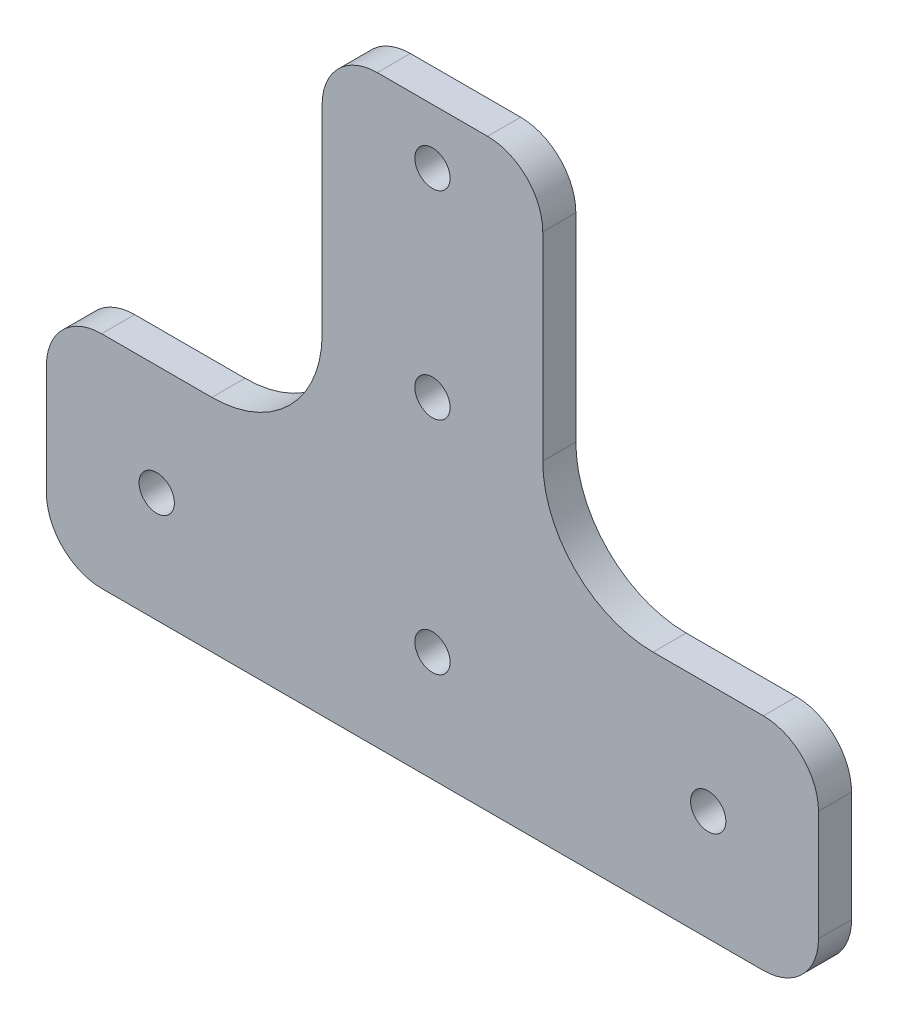
ISO-10303-21;
HEADER;
FILE_DESCRIPTION(('STEP AP214'),'2;1');
FILE_NAME('part.step','',(''),(''),'','','');
FILE_SCHEMA(('AUTOMOTIVE_DESIGN { 1 0 10303 214 1 1 1 1 }'));
ENDSEC;
DATA;
#1=APPLICATION_CONTEXT('core data for automotive mechanical design processes');
#2=APPLICATION_PROTOCOL_DEFINITION('international standard','automotive_design',2000,#1);
#3=PRODUCT_CONTEXT('',#1,'mechanical');
#4=PRODUCT('Part','Part','',(#3));
#5=PRODUCT_RELATED_PRODUCT_CATEGORY('part','',(#4));
#6=PRODUCT_DEFINITION_FORMATION('','',#4);
#7=PRODUCT_DEFINITION_CONTEXT('part definition',#1,'design');
#8=PRODUCT_DEFINITION('design','',#6,#7);
#9=PRODUCT_DEFINITION_SHAPE('','',#8);
#10=(LENGTH_UNIT() NAMED_UNIT(*) SI_UNIT(.MILLI.,.METRE.));
#11=(NAMED_UNIT(*) PLANE_ANGLE_UNIT() SI_UNIT($,.RADIAN.));
#12=(NAMED_UNIT(*) SI_UNIT($,.STERADIAN.) SOLID_ANGLE_UNIT());
#13=UNCERTAINTY_MEASURE_WITH_UNIT(LENGTH_MEASURE(1.E-05),#10,'distance_accuracy_value','');
#14=(GEOMETRIC_REPRESENTATION_CONTEXT(3) GLOBAL_UNCERTAINTY_ASSIGNED_CONTEXT((#13)) GLOBAL_UNIT_ASSIGNED_CONTEXT((#10,
#11,#12)) REPRESENTATION_CONTEXT('',''));
#15=CARTESIAN_POINT('',(0.,0.,0.));
#16=DIRECTION('',(0.,0.,1.));
#17=DIRECTION('',(1.,0.,0.));
#18=AXIS2_PLACEMENT_3D('',#15,#16,#17);
#19=CARTESIAN_POINT('',(0.,0.,3.));
#20=DIRECTION('',(1.,0.,0.));
#21=DIRECTION('',(0.,1.,0.));
#22=AXIS2_PLACEMENT_3D('',#19,#20,#21);
#23=PLANE('',#22);
#24=DIRECTION('',(0.,-1.,0.));
#25=VECTOR('',#24,1.);
#26=CARTESIAN_POINT('',(0.,0.,3.));
#27=LINE('',#26,#25);
#28=CARTESIAN_POINT('',(0.,48.,3.));
#29=VERTEX_POINT('',#28);
#30=CARTESIAN_POINT('',(0.,30.,3.));
#31=VERTEX_POINT('',#30);
#32=EDGE_CURVE('E265',#29,#31,#27,.T.);
#33=ORIENTED_EDGE('',*,*,#32,.F.);
#34=DIRECTION('',(0.,0.,-1.));
#35=VECTOR('',#34,1.);
#36=CARTESIAN_POINT('',(0.,48.,3.));
#37=LINE('',#36,#35);
#38=CARTESIAN_POINT('',(0.,48.,0.));
#39=VERTEX_POINT('',#38);
#40=EDGE_CURVE('E11',#29,#39,#37,.T.);
#41=ORIENTED_EDGE('',*,*,#40,.T.);
#42=DIRECTION('',(0.,-1.,0.));
#43=VECTOR('',#42,1.);
#44=CARTESIAN_POINT('',(0.,0.,0.));
#45=LINE('',#44,#43);
#46=CARTESIAN_POINT('',(0.,30.,0.));
#47=VERTEX_POINT('',#46);
#48=EDGE_CURVE('E269',#39,#47,#45,.T.);
#49=ORIENTED_EDGE('',*,*,#48,.T.);
#50=DIRECTION('',(0.,0.,1.));
#51=VECTOR('',#50,1.);
#52=CARTESIAN_POINT('',(0.,30.,3.));
#53=LINE('',#52,#51);
#54=EDGE_CURVE('E181',#47,#31,#53,.T.);
#55=ORIENTED_EDGE('',*,*,#54,.T.);
#56=EDGE_LOOP('',(#33,#41,#49,#55));
#57=FACE_BOUND('',#56,.T.);
#58=ADVANCED_FACE('F41',(#57),#23,.F.);
#59=CARTESIAN_POINT('',(0.,0.,3.));
#60=DIRECTION('',(0.,1.,0.));
#61=DIRECTION('',(0.,0.,1.));
#62=AXIS2_PLACEMENT_3D('',#59,#60,#61);
#63=PLANE('',#62);
#64=DIRECTION('',(1.,0.,0.));
#65=VECTOR('',#64,1.);
#66=CARTESIAN_POINT('',(0.,0.,0.));
#67=LINE('',#66,#65);
#68=CARTESIAN_POINT('',(-20.,0.,0.));
#69=VERTEX_POINT('',#68);
#70=CARTESIAN_POINT('',(40.,0.,0.));
#71=VERTEX_POINT('',#70);
#72=EDGE_CURVE('E271',#69,#71,#67,.T.);
#73=ORIENTED_EDGE('',*,*,#72,.T.);
#74=DIRECTION('',(0.,0.,1.));
#75=VECTOR('',#74,1.);
#76=CARTESIAN_POINT('',(40.,0.,3.));
#77=LINE('',#76,#75);
#78=CARTESIAN_POINT('',(40.,0.,3.));
#79=VERTEX_POINT('',#78);
#80=EDGE_CURVE('E235',#71,#79,#77,.T.);
#81=ORIENTED_EDGE('',*,*,#80,.T.);
#82=DIRECTION('',(1.,0.,0.));
#83=VECTOR('',#82,1.);
#84=CARTESIAN_POINT('',(0.,0.,3.));
#85=LINE('',#84,#83);
#86=CARTESIAN_POINT('',(-20.,0.,3.));
#87=VERTEX_POINT('',#86);
#88=EDGE_CURVE('E175',#87,#79,#85,.T.);
#89=ORIENTED_EDGE('',*,*,#88,.F.);
#90=DIRECTION('',(0.,0.,1.));
#91=VECTOR('',#90,1.);
#92=CARTESIAN_POINT('',(-20.,0.,0.));
#93=LINE('',#92,#91);
#94=EDGE_CURVE('E233',#87,#69,#93,.F.);
#95=ORIENTED_EDGE('',*,*,#94,.T.);
#96=EDGE_LOOP('',(#73,#81,#89,#95));
#97=FACE_BOUND('',#96,.T.);
#98=ADVANCED_FACE('F343',(#97),#63,.F.);
#99=CARTESIAN_POINT('',(20.,0.,3.));
#100=DIRECTION('',(-1.,0.,0.));
#101=DIRECTION('',(0.,-1.,0.));
#102=AXIS2_PLACEMENT_3D('',#99,#100,#101);
#103=PLANE('',#102);
#104=DIRECTION('',(0.,1.,0.));
#105=VECTOR('',#104,1.);
#106=CARTESIAN_POINT('',(20.,0.,0.));
#107=LINE('',#106,#105);
#108=CARTESIAN_POINT('',(20.,30.,0.));
#109=VERTEX_POINT('',#108);
#110=CARTESIAN_POINT('',(20.,48.,0.));
#111=VERTEX_POINT('',#110);
#112=EDGE_CURVE('E274',#109,#111,#107,.T.);
#113=ORIENTED_EDGE('',*,*,#112,.T.);
#114=DIRECTION('',(0.,0.,-1.));
#115=VECTOR('',#114,1.);
#116=CARTESIAN_POINT('',(20.,48.,3.));
#117=LINE('',#116,#115);
#118=CARTESIAN_POINT('',(20.,48.,3.));
#119=VERTEX_POINT('',#118);
#120=EDGE_CURVE('E173',#111,#119,#117,.F.);
#121=ORIENTED_EDGE('',*,*,#120,.T.);
#122=DIRECTION('',(0.,1.,0.));
#123=VECTOR('',#122,1.);
#124=CARTESIAN_POINT('',(20.,0.,3.));
#125=LINE('',#124,#123);
#126=CARTESIAN_POINT('',(20.,30.,3.));
#127=VERTEX_POINT('',#126);
#128=EDGE_CURVE('E156',#127,#119,#125,.T.);
#129=ORIENTED_EDGE('',*,*,#128,.F.);
#130=DIRECTION('',(0.,0.,-1.));
#131=VECTOR('',#130,1.);
#132=CARTESIAN_POINT('',(20.,30.,3.));
#133=LINE('',#132,#131);
#134=EDGE_CURVE('E170',#127,#109,#133,.T.);
#135=ORIENTED_EDGE('',*,*,#134,.T.);
#136=EDGE_LOOP('',(#113,#121,#129,#135));
#137=FACE_BOUND('',#136,.T.);
#138=ADVANCED_FACE('F169',(#137),#103,.F.);
#139=CARTESIAN_POINT('',(0.,53.,3.));
#140=DIRECTION('',(0.,-1.,0.));
#141=DIRECTION('',(0.,0.,-1.));
#142=AXIS2_PLACEMENT_3D('',#139,#140,#141);
#143=PLANE('',#142);
#144=DIRECTION('',(-1.,0.,0.));
#145=VECTOR('',#144,1.);
#146=CARTESIAN_POINT('',(0.,53.,3.));
#147=LINE('',#146,#145);
#148=CARTESIAN_POINT('',(15.,53.,3.));
#149=VERTEX_POINT('',#148);
#150=CARTESIAN_POINT('',(4.99999999999999,53.,3.));
#151=VERTEX_POINT('',#150);
#152=EDGE_CURVE('E174',#149,#151,#147,.T.);
#153=ORIENTED_EDGE('',*,*,#152,.F.);
#154=DIRECTION('',(0.,0.,-1.));
#155=VECTOR('',#154,1.);
#156=CARTESIAN_POINT('',(15.,53.,3.));
#157=LINE('',#156,#155);
#158=CARTESIAN_POINT('',(15.,53.,0.));
#159=VERTEX_POINT('',#158);
#160=EDGE_CURVE('E200',#149,#159,#157,.T.);
#161=ORIENTED_EDGE('',*,*,#160,.T.);
#162=DIRECTION('',(-1.,0.,0.));
#163=VECTOR('',#162,1.);
#164=CARTESIAN_POINT('',(0.,53.,0.));
#165=LINE('',#164,#163);
#166=CARTESIAN_POINT('',(4.99999999999999,53.,0.));
#167=VERTEX_POINT('',#166);
#168=EDGE_CURVE('E186',#159,#167,#165,.T.);
#169=ORIENTED_EDGE('',*,*,#168,.T.);
#170=DIRECTION('',(0.,0.,-1.));
#171=VECTOR('',#170,1.);
#172=CARTESIAN_POINT('',(4.99999999999999,53.,3.));
#173=LINE('',#172,#171);
#174=EDGE_CURVE('E198',#167,#151,#173,.F.);
#175=ORIENTED_EDGE('',*,*,#174,.T.);
#176=EDGE_LOOP('',(#153,#161,#169,#175));
#177=FACE_BOUND('',#176,.T.);
#178=ADVANCED_FACE('F280',(#177),#143,.F.);
#179=CARTESIAN_POINT('',(0.,0.,3.));
#180=DIRECTION('',(0.,0.,-1.));
#181=DIRECTION('',(-1.,0.,0.));
#182=AXIS2_PLACEMENT_3D('',#179,#180,#181);
#183=PLANE('',#182);
#184=CARTESIAN_POINT('',(9.99999999999999,48.,3.));
#185=DIRECTION('',(0.,0.,1.));
#186=DIRECTION('',(1.,0.,0.));
#187=AXIS2_PLACEMENT_3D('',#184,#185,#186);
#188=CIRCLE('',#187,1.6);
#189=CARTESIAN_POINT('',(11.6,48.,3.));
#190=VERTEX_POINT('',#189);
#191=EDGE_CURVE('E302',#190,#190,#188,.T.);
#192=ORIENTED_EDGE('',*,*,#191,.F.);
#193=EDGE_LOOP('',(#192));
#194=FACE_BOUND('',#193,.T.);
#195=CARTESIAN_POINT('',(35.,10.,3.));
#196=DIRECTION('',(0.,0.,1.));
#197=DIRECTION('',(1.,0.,0.));
#198=AXIS2_PLACEMENT_3D('',#195,#196,#197);
#199=CIRCLE('',#198,1.6);
#200=CARTESIAN_POINT('',(36.6,10.,3.));
#201=VERTEX_POINT('',#200);
#202=EDGE_CURVE('E317',#201,#201,#199,.T.);
#203=ORIENTED_EDGE('',*,*,#202,.F.);
#204=EDGE_LOOP('',(#203));
#205=FACE_BOUND('',#204,.T.);
#206=CARTESIAN_POINT('',(-15.,10.,3.));
#207=DIRECTION('',(0.,0.,1.));
#208=DIRECTION('',(1.,0.,0.));
#209=AXIS2_PLACEMENT_3D('',#206,#207,#208);
#210=CIRCLE('',#209,1.6);
#211=CARTESIAN_POINT('',(-13.4,10.,3.));
#212=VERTEX_POINT('',#211);
#213=EDGE_CURVE('E310',#212,#212,#210,.T.);
#214=ORIENTED_EDGE('',*,*,#213,.F.);
#215=EDGE_LOOP('',(#214));
#216=FACE_BOUND('',#215,.T.);
#217=CARTESIAN_POINT('',(10.,10.,3.));
#218=DIRECTION('',(0.,0.,1.));
#219=DIRECTION('',(1.,0.,0.));
#220=AXIS2_PLACEMENT_3D('',#217,#218,#219);
#221=CIRCLE('',#220,1.6);
#222=CARTESIAN_POINT('',(11.6,10.,3.));
#223=VERTEX_POINT('',#222);
#224=EDGE_CURVE('E328',#223,#223,#221,.T.);
#225=ORIENTED_EDGE('',*,*,#224,.F.);
#226=EDGE_LOOP('',(#225));
#227=FACE_BOUND('',#226,.T.);
#228=CARTESIAN_POINT('',(9.99999999999999,30.,3.));
#229=DIRECTION('',(0.,0.,1.));
#230=DIRECTION('',(1.,0.,0.));
#231=AXIS2_PLACEMENT_3D('',#228,#229,#230);
#232=CIRCLE('',#231,1.6);
#233=CARTESIAN_POINT('',(11.6,30.,3.));
#234=VERTEX_POINT('',#233);
#235=EDGE_CURVE('E307',#234,#234,#232,.T.);
#236=ORIENTED_EDGE('',*,*,#235,.F.);
#237=EDGE_LOOP('',(#236));
#238=FACE_BOUND('',#237,.T.);
#239=ORIENTED_EDGE('',*,*,#128,.T.);
#240=CARTESIAN_POINT('',(15.,48.,3.));
#241=DIRECTION('',(0.,0.,-1.));
#242=DIRECTION('',(-1.,0.,0.));
#243=AXIS2_PLACEMENT_3D('',#240,#241,#242);
#244=CIRCLE('',#243,5.);
#245=EDGE_CURVE('E225',#119,#149,#244,.F.);
#246=ORIENTED_EDGE('',*,*,#245,.T.);
#247=ORIENTED_EDGE('',*,*,#152,.T.);
#248=CARTESIAN_POINT('',(4.99999999999999,48.,3.));
#249=DIRECTION('',(0.,0.,-1.));
#250=DIRECTION('',(-1.,0.,0.));
#251=AXIS2_PLACEMENT_3D('',#248,#249,#250);
#252=CIRCLE('',#251,5.);
#253=EDGE_CURVE('E216',#151,#29,#252,.F.);
#254=ORIENTED_EDGE('',*,*,#253,.T.);
#255=ORIENTED_EDGE('',*,*,#32,.T.);
#256=CARTESIAN_POINT('',(-10.,30.,3.));
#257=DIRECTION('',(0.,0.,-1.));
#258=DIRECTION('',(-1.,0.,0.));
#259=AXIS2_PLACEMENT_3D('',#256,#257,#258);
#260=CIRCLE('',#259,10.);
#261=CARTESIAN_POINT('',(-10.,20.,3.));
#262=VERTEX_POINT('',#261);
#263=EDGE_CURVE('E163',#31,#262,#260,.T.);
#264=ORIENTED_EDGE('',*,*,#263,.T.);
#265=DIRECTION('',(-1.,0.,0.));
#266=VECTOR('',#265,1.);
#267=CARTESIAN_POINT('',(-25.,20.,3.));
#268=LINE('',#267,#266);
#269=CARTESIAN_POINT('',(-20.,20.,3.));
#270=VERTEX_POINT('',#269);
#271=EDGE_CURVE('E249',#262,#270,#268,.T.);
#272=ORIENTED_EDGE('',*,*,#271,.T.);
#273=CARTESIAN_POINT('',(-20.,15.,3.));
#274=DIRECTION('',(0.,0.,-1.));
#275=DIRECTION('',(-1.,0.,0.));
#276=AXIS2_PLACEMENT_3D('',#273,#274,#275);
#277=CIRCLE('',#276,5.);
#278=CARTESIAN_POINT('',(-25.,15.,3.));
#279=VERTEX_POINT('',#278);
#280=EDGE_CURVE('E218',#270,#279,#277,.F.);
#281=ORIENTED_EDGE('',*,*,#280,.T.);
#282=DIRECTION('',(0.,-1.,0.));
#283=VECTOR('',#282,1.);
#284=CARTESIAN_POINT('',(-25.,0.,3.));
#285=LINE('',#284,#283);
#286=CARTESIAN_POINT('',(-25.,5.,3.));
#287=VERTEX_POINT('',#286);
#288=EDGE_CURVE('E261',#279,#287,#285,.T.);
#289=ORIENTED_EDGE('',*,*,#288,.T.);
#290=CARTESIAN_POINT('',(-20.,5.,3.));
#291=DIRECTION('',(0.,0.,-1.));
#292=DIRECTION('',(-1.,0.,0.));
#293=AXIS2_PLACEMENT_3D('',#290,#291,#292);
#294=CIRCLE('',#293,5.);
#295=EDGE_CURVE('E220',#287,#87,#294,.F.);
#296=ORIENTED_EDGE('',*,*,#295,.T.);
#297=ORIENTED_EDGE('',*,*,#88,.T.);
#298=CARTESIAN_POINT('',(40.,5.,3.));
#299=DIRECTION('',(0.,0.,-1.));
#300=DIRECTION('',(-1.,0.,0.));
#301=AXIS2_PLACEMENT_3D('',#298,#299,#300);
#302=CIRCLE('',#301,5.);
#303=CARTESIAN_POINT('',(45.,5.,3.));
#304=VERTEX_POINT('',#303);
#305=EDGE_CURVE('E222',#79,#304,#302,.F.);
#306=ORIENTED_EDGE('',*,*,#305,.T.);
#307=DIRECTION('',(0.,1.,0.));
#308=VECTOR('',#307,1.);
#309=CARTESIAN_POINT('',(45.,0.,3.));
#310=LINE('',#309,#308);
#311=CARTESIAN_POINT('',(45.,15.,3.));
#312=VERTEX_POINT('',#311);
#313=EDGE_CURVE('E258',#304,#312,#310,.T.);
#314=ORIENTED_EDGE('',*,*,#313,.T.);
#315=CARTESIAN_POINT('',(40.,15.,3.));
#316=DIRECTION('',(0.,0.,-1.));
#317=DIRECTION('',(-1.,0.,0.));
#318=AXIS2_PLACEMENT_3D('',#315,#316,#317);
#319=CIRCLE('',#318,5.);
#320=CARTESIAN_POINT('',(40.,20.,3.));
#321=VERTEX_POINT('',#320);
#322=EDGE_CURVE('E56',#312,#321,#319,.F.);
#323=ORIENTED_EDGE('',*,*,#322,.T.);
#324=CARTESIAN_POINT('',(30.,20.,3.));
#325=VERTEX_POINT('',#324);
#326=EDGE_CURVE('E158',#321,#325,#268,.T.);
#327=ORIENTED_EDGE('',*,*,#326,.T.);
#328=CARTESIAN_POINT('',(30.,30.,3.));
#329=DIRECTION('',(0.,0.,-1.));
#330=DIRECTION('',(-1.,0.,0.));
#331=AXIS2_PLACEMENT_3D('',#328,#329,#330);
#332=CIRCLE('',#331,10.);
#333=EDGE_CURVE('E153',#325,#127,#332,.T.);
#334=ORIENTED_EDGE('',*,*,#333,.T.);
#335=EDGE_LOOP('',(#239,#246,#247,#254,#255,#264,#272,#281,#289,#296,#297,#306,#314,#323,#327,#334));
#336=FACE_BOUND('',#335,.T.);
#337=ADVANCED_FACE('F155',(#194,#205,#216,#227,#238,#336),#183,.F.);
#338=CARTESIAN_POINT('',(0.,0.,0.));
#339=DIRECTION('',(0.,0.,-1.));
#340=DIRECTION('',(-1.,0.,0.));
#341=AXIS2_PLACEMENT_3D('',#338,#339,#340);
#342=PLANE('',#341);
#343=CARTESIAN_POINT('',(9.99999999999999,48.,0.));
#344=DIRECTION('',(0.,0.,1.));
#345=DIRECTION('',(1.,0.,0.));
#346=AXIS2_PLACEMENT_3D('',#343,#344,#345);
#347=CIRCLE('',#346,1.6);
#348=CARTESIAN_POINT('',(11.6,48.,0.));
#349=VERTEX_POINT('',#348);
#350=EDGE_CURVE('E300',#349,#349,#347,.T.);
#351=ORIENTED_EDGE('',*,*,#350,.T.);
#352=EDGE_LOOP('',(#351));
#353=FACE_BOUND('',#352,.T.);
#354=CARTESIAN_POINT('',(35.,10.,0.));
#355=DIRECTION('',(0.,0.,1.));
#356=DIRECTION('',(1.,0.,0.));
#357=AXIS2_PLACEMENT_3D('',#354,#355,#356);
#358=CIRCLE('',#357,1.6);
#359=CARTESIAN_POINT('',(36.6,10.,0.));
#360=VERTEX_POINT('',#359);
#361=EDGE_CURVE('E320',#360,#360,#358,.T.);
#362=ORIENTED_EDGE('',*,*,#361,.T.);
#363=EDGE_LOOP('',(#362));
#364=FACE_BOUND('',#363,.T.);
#365=CARTESIAN_POINT('',(-15.,10.,0.));
#366=DIRECTION('',(0.,0.,1.));
#367=DIRECTION('',(1.,0.,0.));
#368=AXIS2_PLACEMENT_3D('',#365,#366,#367);
#369=CIRCLE('',#368,1.6);
#370=CARTESIAN_POINT('',(-13.4,10.,0.));
#371=VERTEX_POINT('',#370);
#372=EDGE_CURVE('E314',#371,#371,#369,.T.);
#373=ORIENTED_EDGE('',*,*,#372,.T.);
#374=EDGE_LOOP('',(#373));
#375=FACE_BOUND('',#374,.T.);
#376=CARTESIAN_POINT('',(10.,10.,0.));
#377=DIRECTION('',(0.,0.,1.));
#378=DIRECTION('',(1.,0.,0.));
#379=AXIS2_PLACEMENT_3D('',#376,#377,#378);
#380=CIRCLE('',#379,1.6);
#381=CARTESIAN_POINT('',(11.6,10.,0.));
#382=VERTEX_POINT('',#381);
#383=EDGE_CURVE('E313',#382,#382,#380,.T.);
#384=ORIENTED_EDGE('',*,*,#383,.T.);
#385=EDGE_LOOP('',(#384));
#386=FACE_BOUND('',#385,.T.);
#387=CARTESIAN_POINT('',(9.99999999999999,30.,0.));
#388=DIRECTION('',(0.,0.,1.));
#389=DIRECTION('',(1.,0.,0.));
#390=AXIS2_PLACEMENT_3D('',#387,#388,#389);
#391=CIRCLE('',#390,1.6);
#392=CARTESIAN_POINT('',(11.6,30.,0.));
#393=VERTEX_POINT('',#392);
#394=EDGE_CURVE('E325',#393,#393,#391,.T.);
#395=ORIENTED_EDGE('',*,*,#394,.T.);
#396=EDGE_LOOP('',(#395));
#397=FACE_BOUND('',#396,.T.);
#398=ORIENTED_EDGE('',*,*,#168,.F.);
#399=CARTESIAN_POINT('',(15.,48.,0.));
#400=DIRECTION('',(0.,0.,-1.));
#401=DIRECTION('',(-1.,0.,0.));
#402=AXIS2_PLACEMENT_3D('',#399,#400,#401);
#403=CIRCLE('',#402,5.);
#404=EDGE_CURVE('E213',#159,#111,#403,.T.);
#405=ORIENTED_EDGE('',*,*,#404,.T.);
#406=ORIENTED_EDGE('',*,*,#112,.F.);
#407=CARTESIAN_POINT('',(30.,30.,0.));
#408=DIRECTION('',(0.,0.,-1.));
#409=DIRECTION('',(-1.,0.,0.));
#410=AXIS2_PLACEMENT_3D('',#407,#408,#409);
#411=CIRCLE('',#410,10.);
#412=CARTESIAN_POINT('',(30.,20.,0.));
#413=VERTEX_POINT('',#412);
#414=EDGE_CURVE('E164',#109,#413,#411,.F.);
#415=ORIENTED_EDGE('',*,*,#414,.T.);
#416=DIRECTION('',(-1.,0.,0.));
#417=VECTOR('',#416,1.);
#418=CARTESIAN_POINT('',(-25.,20.,0.));
#419=LINE('',#418,#417);
#420=CARTESIAN_POINT('',(40.,20.,0.));
#421=VERTEX_POINT('',#420);
#422=EDGE_CURVE('E272',#421,#413,#419,.T.);
#423=ORIENTED_EDGE('',*,*,#422,.F.);
#424=CARTESIAN_POINT('',(40.,15.,0.));
#425=DIRECTION('',(0.,0.,-1.));
#426=DIRECTION('',(-1.,0.,0.));
#427=AXIS2_PLACEMENT_3D('',#424,#425,#426);
#428=CIRCLE('',#427,5.);
#429=CARTESIAN_POINT('',(45.,15.,0.));
#430=VERTEX_POINT('',#429);
#431=EDGE_CURVE('E211',#421,#430,#428,.T.);
#432=ORIENTED_EDGE('',*,*,#431,.T.);
#433=DIRECTION('',(0.,1.,0.));
#434=VECTOR('',#433,1.);
#435=CARTESIAN_POINT('',(45.,0.,0.));
#436=LINE('',#435,#434);
#437=CARTESIAN_POINT('',(45.,5.,0.));
#438=VERTEX_POINT('',#437);
#439=EDGE_CURVE('E295',#438,#430,#436,.T.);
#440=ORIENTED_EDGE('',*,*,#439,.F.);
#441=CARTESIAN_POINT('',(40.,5.,0.));
#442=DIRECTION('',(0.,0.,-1.));
#443=DIRECTION('',(-1.,0.,0.));
#444=AXIS2_PLACEMENT_3D('',#441,#442,#443);
#445=CIRCLE('',#444,5.);
#446=EDGE_CURVE('E209',#438,#71,#445,.T.);
#447=ORIENTED_EDGE('',*,*,#446,.T.);
#448=ORIENTED_EDGE('',*,*,#72,.F.);
#449=CARTESIAN_POINT('',(-20.,5.,0.));
#450=DIRECTION('',(0.,0.,-1.));
#451=DIRECTION('',(-1.,0.,0.));
#452=AXIS2_PLACEMENT_3D('',#449,#450,#451);
#453=CIRCLE('',#452,5.);
#454=CARTESIAN_POINT('',(-25.,5.,0.));
#455=VERTEX_POINT('',#454);
#456=EDGE_CURVE('E207',#69,#455,#453,.T.);
#457=ORIENTED_EDGE('',*,*,#456,.T.);
#458=DIRECTION('',(0.,-1.,0.));
#459=VECTOR('',#458,1.);
#460=CARTESIAN_POINT('',(-25.,0.,0.));
#461=LINE('',#460,#459);
#462=CARTESIAN_POINT('',(-25.,15.,0.));
#463=VERTEX_POINT('',#462);
#464=EDGE_CURVE('E260',#463,#455,#461,.T.);
#465=ORIENTED_EDGE('',*,*,#464,.F.);
#466=CARTESIAN_POINT('',(-20.,15.,0.));
#467=DIRECTION('',(0.,0.,-1.));
#468=DIRECTION('',(-1.,0.,0.));
#469=AXIS2_PLACEMENT_3D('',#466,#467,#468);
#470=CIRCLE('',#469,5.);
#471=CARTESIAN_POINT('',(-20.,20.,0.));
#472=VERTEX_POINT('',#471);
#473=EDGE_CURVE('E205',#463,#472,#470,.T.);
#474=ORIENTED_EDGE('',*,*,#473,.T.);
#475=CARTESIAN_POINT('',(-10.,20.,0.));
#476=VERTEX_POINT('',#475);
#477=EDGE_CURVE('E252',#476,#472,#419,.T.);
#478=ORIENTED_EDGE('',*,*,#477,.F.);
#479=CARTESIAN_POINT('',(-10.,30.,0.));
#480=DIRECTION('',(0.,0.,-1.));
#481=DIRECTION('',(-1.,0.,0.));
#482=AXIS2_PLACEMENT_3D('',#479,#480,#481);
#483=CIRCLE('',#482,10.);
#484=EDGE_CURVE('E195',#476,#47,#483,.F.);
#485=ORIENTED_EDGE('',*,*,#484,.T.);
#486=ORIENTED_EDGE('',*,*,#48,.F.);
#487=CARTESIAN_POINT('',(4.99999999999999,48.,0.));
#488=DIRECTION('',(0.,0.,-1.));
#489=DIRECTION('',(-1.,0.,0.));
#490=AXIS2_PLACEMENT_3D('',#487,#488,#489);
#491=CIRCLE('',#490,5.);
#492=EDGE_CURVE('E203',#39,#167,#491,.T.);
#493=ORIENTED_EDGE('',*,*,#492,.T.);
#494=EDGE_LOOP('',(#398,#405,#406,#415,#423,#432,#440,#447,#448,#457,#465,#474,#478,#485,#486,#493));
#495=FACE_BOUND('',#494,.T.);
#496=ADVANCED_FACE('F293',(#353,#364,#375,#386,#397,#495),#342,.T.);
#497=CARTESIAN_POINT('',(45.,0.,0.));
#498=DIRECTION('',(1.,0.,0.));
#499=DIRECTION('',(0.,0.,-1.));
#500=AXIS2_PLACEMENT_3D('',#497,#498,#499);
#501=PLANE('',#500);
#502=ORIENTED_EDGE('',*,*,#439,.T.);
#503=DIRECTION('',(0.,0.,1.));
#504=VECTOR('',#503,1.);
#505=CARTESIAN_POINT('',(45.,15.,0.));
#506=LINE('',#505,#504);
#507=EDGE_CURVE('E229',#430,#312,#506,.T.);
#508=ORIENTED_EDGE('',*,*,#507,.T.);
#509=ORIENTED_EDGE('',*,*,#313,.F.);
#510=DIRECTION('',(0.,0.,1.));
#511=VECTOR('',#510,1.);
#512=CARTESIAN_POINT('',(45.,5.,0.));
#513=LINE('',#512,#511);
#514=EDGE_CURVE('E227',#304,#438,#513,.F.);
#515=ORIENTED_EDGE('',*,*,#514,.T.);
#516=EDGE_LOOP('',(#502,#508,#509,#515));
#517=FACE_BOUND('',#516,.T.);
#518=ADVANCED_FACE('F352',(#517),#501,.T.);
#519=CARTESIAN_POINT('',(-25.,20.,0.));
#520=DIRECTION('',(0.,1.,0.));
#521=DIRECTION('',(0.,0.,1.));
#522=AXIS2_PLACEMENT_3D('',#519,#520,#521);
#523=PLANE('',#522);
#524=ORIENTED_EDGE('',*,*,#326,.F.);
#525=DIRECTION('',(0.,0.,1.));
#526=VECTOR('',#525,1.);
#527=CARTESIAN_POINT('',(40.,20.,0.));
#528=LINE('',#527,#526);
#529=EDGE_CURVE('E231',#321,#421,#528,.F.);
#530=ORIENTED_EDGE('',*,*,#529,.T.);
#531=ORIENTED_EDGE('',*,*,#422,.T.);
#532=DIRECTION('',(0.,0.,-1.));
#533=VECTOR('',#532,1.);
#534=CARTESIAN_POINT('',(30.,20.,0.));
#535=LINE('',#534,#533);
#536=EDGE_CURVE('E179',#413,#325,#535,.F.);
#537=ORIENTED_EDGE('',*,*,#536,.T.);
#538=EDGE_LOOP('',(#524,#530,#531,#537));
#539=FACE_BOUND('',#538,.T.);
#540=ADVANCED_FACE('F358',(#539),#523,.T.);
#541=ORIENTED_EDGE('',*,*,#477,.T.);
#542=DIRECTION('',(0.,0.,1.));
#543=VECTOR('',#542,1.);
#544=CARTESIAN_POINT('',(-20.,20.,0.));
#545=LINE('',#544,#543);
#546=EDGE_CURVE('E49',#472,#270,#545,.T.);
#547=ORIENTED_EDGE('',*,*,#546,.T.);
#548=ORIENTED_EDGE('',*,*,#271,.F.);
#549=DIRECTION('',(0.,0.,1.));
#550=VECTOR('',#549,1.);
#551=CARTESIAN_POINT('',(-10.,20.,0.));
#552=LINE('',#551,#550);
#553=EDGE_CURVE('E191',#262,#476,#552,.F.);
#554=ORIENTED_EDGE('',*,*,#553,.T.);
#555=EDGE_LOOP('',(#541,#547,#548,#554));
#556=FACE_BOUND('',#555,.T.);
#557=ADVANCED_FACE('F248',(#556),#523,.T.);
#558=CARTESIAN_POINT('',(-25.,0.,0.));
#559=DIRECTION('',(-1.,0.,0.));
#560=DIRECTION('',(0.,0.,1.));
#561=AXIS2_PLACEMENT_3D('',#558,#559,#560);
#562=PLANE('',#561);
#563=ORIENTED_EDGE('',*,*,#464,.T.);
#564=DIRECTION('',(0.,0.,1.));
#565=VECTOR('',#564,1.);
#566=CARTESIAN_POINT('',(-25.,5.,3.));
#567=LINE('',#566,#565);
#568=EDGE_CURVE('E240',#455,#287,#567,.T.);
#569=ORIENTED_EDGE('',*,*,#568,.T.);
#570=ORIENTED_EDGE('',*,*,#288,.F.);
#571=DIRECTION('',(0.,0.,1.));
#572=VECTOR('',#571,1.);
#573=CARTESIAN_POINT('',(-25.,15.,0.));
#574=LINE('',#573,#572);
#575=EDGE_CURVE('E238',#279,#463,#574,.F.);
#576=ORIENTED_EDGE('',*,*,#575,.T.);
#577=EDGE_LOOP('',(#563,#569,#570,#576));
#578=FACE_BOUND('',#577,.T.);
#579=ADVANCED_FACE('F335',(#578),#562,.T.);
#580=CARTESIAN_POINT('',(9.99999999999999,30.,0.));
#581=DIRECTION('',(0.,0.,1.));
#582=DIRECTION('',(1.,0.,0.));
#583=AXIS2_PLACEMENT_3D('',#580,#581,#582);
#584=CYLINDRICAL_SURFACE('',#583,1.6);
#585=ORIENTED_EDGE('',*,*,#394,.F.);
#586=EDGE_LOOP('',(#585));
#587=FACE_BOUND('',#586,.T.);
#588=ORIENTED_EDGE('',*,*,#235,.T.);
#589=EDGE_LOOP('',(#588));
#590=FACE_BOUND('',#589,.T.);
#591=ADVANCED_FACE('F477',(#587,#590),#584,.F.);
#592=CARTESIAN_POINT('',(10.,10.,0.));
#593=DIRECTION('',(0.,0.,1.));
#594=DIRECTION('',(1.,0.,0.));
#595=AXIS2_PLACEMENT_3D('',#592,#593,#594);
#596=CYLINDRICAL_SURFACE('',#595,1.6);
#597=ORIENTED_EDGE('',*,*,#383,.F.);
#598=EDGE_LOOP('',(#597));
#599=FACE_BOUND('',#598,.T.);
#600=ORIENTED_EDGE('',*,*,#224,.T.);
#601=EDGE_LOOP('',(#600));
#602=FACE_BOUND('',#601,.T.);
#603=ADVANCED_FACE('F467',(#599,#602),#596,.F.);
#604=CARTESIAN_POINT('',(-15.,10.,0.));
#605=DIRECTION('',(0.,0.,1.));
#606=DIRECTION('',(1.,0.,0.));
#607=AXIS2_PLACEMENT_3D('',#604,#605,#606);
#608=CYLINDRICAL_SURFACE('',#607,1.6);
#609=ORIENTED_EDGE('',*,*,#372,.F.);
#610=EDGE_LOOP('',(#609));
#611=FACE_BOUND('',#610,.T.);
#612=ORIENTED_EDGE('',*,*,#213,.T.);
#613=EDGE_LOOP('',(#612));
#614=FACE_BOUND('',#613,.T.);
#615=ADVANCED_FACE('F457',(#611,#614),#608,.F.);
#616=CARTESIAN_POINT('',(35.,10.,0.));
#617=DIRECTION('',(0.,0.,1.));
#618=DIRECTION('',(1.,0.,0.));
#619=AXIS2_PLACEMENT_3D('',#616,#617,#618);
#620=CYLINDRICAL_SURFACE('',#619,1.6);
#621=ORIENTED_EDGE('',*,*,#361,.F.);
#622=EDGE_LOOP('',(#621));
#623=FACE_BOUND('',#622,.T.);
#624=ORIENTED_EDGE('',*,*,#202,.T.);
#625=EDGE_LOOP('',(#624));
#626=FACE_BOUND('',#625,.T.);
#627=ADVANCED_FACE('F447',(#623,#626),#620,.F.);
#628=CARTESIAN_POINT('',(9.99999999999999,48.,0.));
#629=DIRECTION('',(0.,0.,1.));
#630=DIRECTION('',(1.,0.,0.));
#631=AXIS2_PLACEMENT_3D('',#628,#629,#630);
#632=CYLINDRICAL_SURFACE('',#631,1.6);
#633=ORIENTED_EDGE('',*,*,#350,.F.);
#634=EDGE_LOOP('',(#633));
#635=FACE_BOUND('',#634,.T.);
#636=ORIENTED_EDGE('',*,*,#191,.T.);
#637=EDGE_LOOP('',(#636));
#638=FACE_BOUND('',#637,.T.);
#639=ADVANCED_FACE('F378',(#635,#638),#632,.F.);
#640=CARTESIAN_POINT('',(30.,30.,3.));
#641=DIRECTION('',(0.,0.,-1.));
#642=DIRECTION('',(-1.,0.,0.));
#643=AXIS2_PLACEMENT_3D('',#640,#641,#642);
#644=CYLINDRICAL_SURFACE('',#643,10.);
#645=ORIENTED_EDGE('',*,*,#333,.F.);
#646=ORIENTED_EDGE('',*,*,#536,.F.);
#647=ORIENTED_EDGE('',*,*,#414,.F.);
#648=ORIENTED_EDGE('',*,*,#134,.F.);
#649=EDGE_LOOP('',(#645,#646,#647,#648));
#650=FACE_BOUND('',#649,.T.);
#651=ADVANCED_FACE('F177',(#650),#644,.F.);
#652=CARTESIAN_POINT('',(-10.,30.,3.));
#653=DIRECTION('',(0.,0.,1.));
#654=DIRECTION('',(1.,0.,0.));
#655=AXIS2_PLACEMENT_3D('',#652,#653,#654);
#656=CYLINDRICAL_SURFACE('',#655,10.);
#657=ORIENTED_EDGE('',*,*,#484,.F.);
#658=ORIENTED_EDGE('',*,*,#553,.F.);
#659=ORIENTED_EDGE('',*,*,#263,.F.);
#660=ORIENTED_EDGE('',*,*,#54,.F.);
#661=EDGE_LOOP('',(#657,#658,#659,#660));
#662=FACE_BOUND('',#661,.T.);
#663=ADVANCED_FACE('F292',(#662),#656,.F.);
#664=CARTESIAN_POINT('',(15.,48.,3.));
#665=DIRECTION('',(0.,0.,-1.));
#666=DIRECTION('',(-1.,0.,0.));
#667=AXIS2_PLACEMENT_3D('',#664,#665,#666);
#668=CYLINDRICAL_SURFACE('',#667,5.);
#669=ORIENTED_EDGE('',*,*,#245,.F.);
#670=ORIENTED_EDGE('',*,*,#120,.F.);
#671=ORIENTED_EDGE('',*,*,#404,.F.);
#672=ORIENTED_EDGE('',*,*,#160,.F.);
#673=EDGE_LOOP('',(#669,#670,#671,#672));
#674=FACE_BOUND('',#673,.T.);
#675=ADVANCED_FACE('F380',(#674),#668,.T.);
#676=CARTESIAN_POINT('',(40.,15.,0.));
#677=DIRECTION('',(0.,0.,1.));
#678=DIRECTION('',(1.,0.,0.));
#679=AXIS2_PLACEMENT_3D('',#676,#677,#678);
#680=CYLINDRICAL_SURFACE('',#679,5.);
#681=ORIENTED_EDGE('',*,*,#431,.F.);
#682=ORIENTED_EDGE('',*,*,#529,.F.);
#683=ORIENTED_EDGE('',*,*,#322,.F.);
#684=ORIENTED_EDGE('',*,*,#507,.F.);
#685=EDGE_LOOP('',(#681,#682,#683,#684));
#686=FACE_BOUND('',#685,.T.);
#687=ADVANCED_FACE('F355',(#686),#680,.T.);
#688=CARTESIAN_POINT('',(40.,5.,3.));
#689=DIRECTION('',(0.,0.,-1.));
#690=DIRECTION('',(-1.,0.,0.));
#691=AXIS2_PLACEMENT_3D('',#688,#689,#690);
#692=CYLINDRICAL_SURFACE('',#691,5.);
#693=ORIENTED_EDGE('',*,*,#446,.F.);
#694=ORIENTED_EDGE('',*,*,#514,.F.);
#695=ORIENTED_EDGE('',*,*,#305,.F.);
#696=ORIENTED_EDGE('',*,*,#80,.F.);
#697=EDGE_LOOP('',(#693,#694,#695,#696));
#698=FACE_BOUND('',#697,.T.);
#699=ADVANCED_FACE('F348',(#698),#692,.T.);
#700=CARTESIAN_POINT('',(-20.,5.,0.));
#701=DIRECTION('',(0.,0.,-1.));
#702=DIRECTION('',(-1.,0.,0.));
#703=AXIS2_PLACEMENT_3D('',#700,#701,#702);
#704=CYLINDRICAL_SURFACE('',#703,5.);
#705=ORIENTED_EDGE('',*,*,#456,.F.);
#706=ORIENTED_EDGE('',*,*,#94,.F.);
#707=ORIENTED_EDGE('',*,*,#295,.F.);
#708=ORIENTED_EDGE('',*,*,#568,.F.);
#709=EDGE_LOOP('',(#705,#706,#707,#708));
#710=FACE_BOUND('',#709,.T.);
#711=ADVANCED_FACE('F339',(#710),#704,.T.);
#712=CARTESIAN_POINT('',(-20.,15.,0.));
#713=DIRECTION('',(0.,0.,1.));
#714=DIRECTION('',(1.,0.,0.));
#715=AXIS2_PLACEMENT_3D('',#712,#713,#714);
#716=CYLINDRICAL_SURFACE('',#715,5.);
#717=ORIENTED_EDGE('',*,*,#473,.F.);
#718=ORIENTED_EDGE('',*,*,#575,.F.);
#719=ORIENTED_EDGE('',*,*,#280,.F.);
#720=ORIENTED_EDGE('',*,*,#546,.F.);
#721=EDGE_LOOP('',(#717,#718,#719,#720));
#722=FACE_BOUND('',#721,.T.);
#723=ADVANCED_FACE('F389',(#722),#716,.T.);
#724=CARTESIAN_POINT('',(4.99999999999999,48.,3.));
#725=DIRECTION('',(0.,0.,-1.));
#726=DIRECTION('',(-1.,0.,0.));
#727=AXIS2_PLACEMENT_3D('',#724,#725,#726);
#728=CYLINDRICAL_SURFACE('',#727,5.);
#729=ORIENTED_EDGE('',*,*,#253,.F.);
#730=ORIENTED_EDGE('',*,*,#174,.F.);
#731=ORIENTED_EDGE('',*,*,#492,.F.);
#732=ORIENTED_EDGE('',*,*,#40,.F.);
#733=EDGE_LOOP('',(#729,#730,#731,#732));
#734=FACE_BOUND('',#733,.T.);
#735=ADVANCED_FACE('F43',(#734),#728,.T.);
#736=CLOSED_SHELL('',(#58,#98,#138,#178,#337,#496,#518,#540,#557,#579,#591,#603,#615,#627,#639,
#651,#663,#675,#687,#699,#711,#723,#735));
#737=MANIFOLD_SOLID_BREP('B2',#736);
#738=ADVANCED_BREP_SHAPE_REPRESENTATION('',(#18,#737),#14);
#739=SHAPE_DEFINITION_REPRESENTATION(#9,#738);
ENDSEC;
END-ISO-10303-21;
